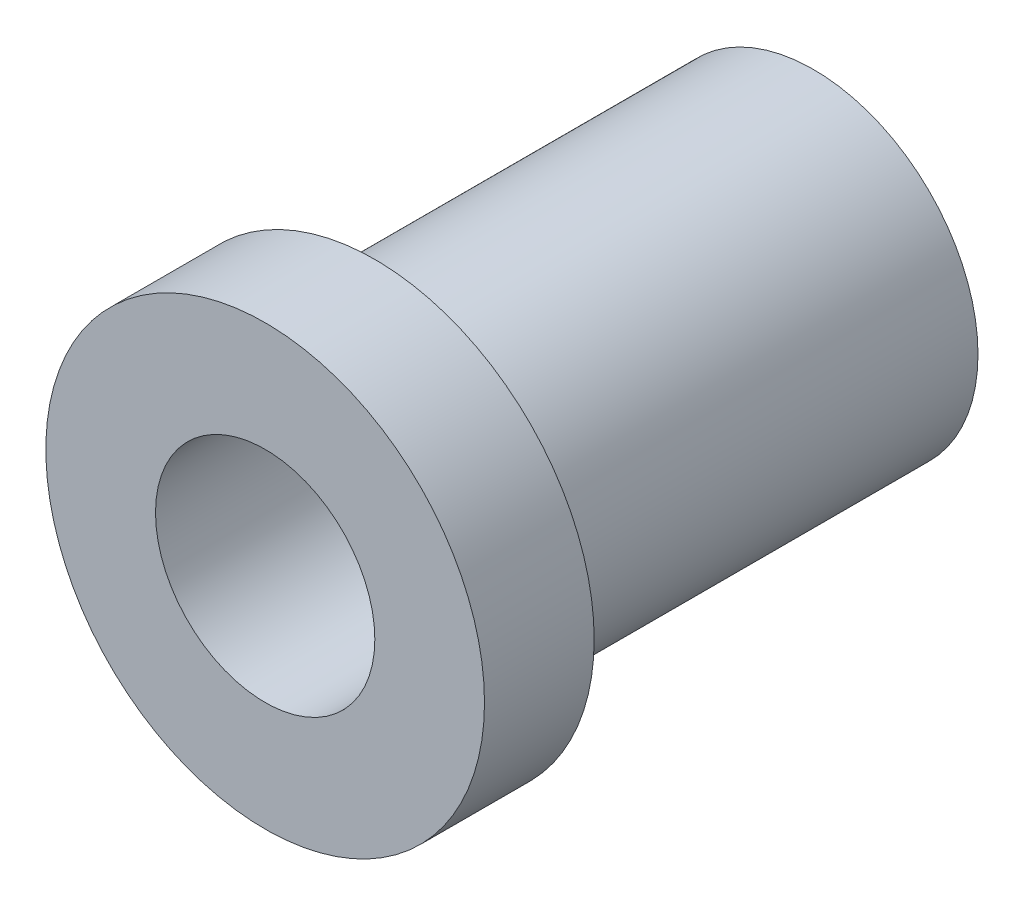
ISO-10303-21;
HEADER;
FILE_DESCRIPTION(('STEP AP214'),'2;1');
FILE_NAME('part.step','',(''),(''),'','','');
FILE_SCHEMA(('AUTOMOTIVE_DESIGN { 1 0 10303 214 1 1 1 1 }'));
ENDSEC;
DATA;
#1=APPLICATION_CONTEXT('core data for automotive mechanical design processes');
#2=APPLICATION_PROTOCOL_DEFINITION('international standard','automotive_design',2000,#1);
#3=PRODUCT_CONTEXT('',#1,'mechanical');
#4=PRODUCT('Part','Part','',(#3));
#5=PRODUCT_RELATED_PRODUCT_CATEGORY('part','',(#4));
#6=PRODUCT_DEFINITION_FORMATION('','',#4);
#7=PRODUCT_DEFINITION_CONTEXT('part definition',#1,'design');
#8=PRODUCT_DEFINITION('design','',#6,#7);
#9=PRODUCT_DEFINITION_SHAPE('','',#8);
#10=(LENGTH_UNIT() NAMED_UNIT(*) SI_UNIT(.MILLI.,.METRE.));
#11=(NAMED_UNIT(*) PLANE_ANGLE_UNIT() SI_UNIT($,.RADIAN.));
#12=(NAMED_UNIT(*) SI_UNIT($,.STERADIAN.) SOLID_ANGLE_UNIT());
#13=UNCERTAINTY_MEASURE_WITH_UNIT(LENGTH_MEASURE(1.E-05),#10,'distance_accuracy_value','');
#14=(GEOMETRIC_REPRESENTATION_CONTEXT(3) GLOBAL_UNCERTAINTY_ASSIGNED_CONTEXT((#13)) GLOBAL_UNIT_ASSIGNED_CONTEXT((#10,
#11,#12)) REPRESENTATION_CONTEXT('',''));
#15=CARTESIAN_POINT('',(0.,0.,0.));
#16=DIRECTION('',(0.,0.,1.));
#17=DIRECTION('',(1.,0.,0.));
#18=AXIS2_PLACEMENT_3D('',#15,#16,#17);
#19=CARTESIAN_POINT('',(0.,0.,2.));
#20=DIRECTION('',(0.,0.,-1.));
#21=DIRECTION('',(-1.,0.,0.));
#22=AXIS2_PLACEMENT_3D('',#19,#20,#21);
#23=CYLINDRICAL_SURFACE('',#22,4.);
#24=CARTESIAN_POINT('',(0.,0.,2.));
#25=DIRECTION('',(0.,0.,1.));
#26=DIRECTION('',(1.,0.,0.));
#27=AXIS2_PLACEMENT_3D('',#24,#25,#26);
#28=CIRCLE('',#27,4.);
#29=CARTESIAN_POINT('',(4.,0.,2.));
#30=VERTEX_POINT('',#29);
#31=EDGE_CURVE('E10',#30,#30,#28,.T.);
#32=ORIENTED_EDGE('',*,*,#31,.F.);
#33=EDGE_LOOP('',(#32));
#34=FACE_BOUND('',#33,.T.);
#35=CARTESIAN_POINT('',(0.,0.,0.));
#36=DIRECTION('',(0.,0.,1.));
#37=DIRECTION('',(1.,0.,0.));
#38=AXIS2_PLACEMENT_3D('',#35,#36,#37);
#39=CIRCLE('',#38,4.);
#40=CARTESIAN_POINT('',(4.,0.,0.));
#41=VERTEX_POINT('',#40);
#42=EDGE_CURVE('E44',#41,#41,#39,.T.);
#43=ORIENTED_EDGE('',*,*,#42,.T.);
#44=EDGE_LOOP('',(#43));
#45=FACE_BOUND('',#44,.T.);
#46=ADVANCED_FACE('F41',(#34,#45),#23,.T.);
#47=CARTESIAN_POINT('',(0.,0.,2.));
#48=DIRECTION('',(0.,0.,1.));
#49=DIRECTION('',(1.,0.,0.));
#50=AXIS2_PLACEMENT_3D('',#47,#48,#49);
#51=PLANE('',#50);
#52=CARTESIAN_POINT('',(0.,0.,2.));
#53=DIRECTION('',(0.,0.,1.));
#54=DIRECTION('',(1.,0.,0.));
#55=AXIS2_PLACEMENT_3D('',#52,#53,#54);
#56=CIRCLE('',#55,2.);
#57=CARTESIAN_POINT('',(2.,0.,2.));
#58=VERTEX_POINT('',#57);
#59=EDGE_CURVE('E63',#58,#58,#56,.T.);
#60=ORIENTED_EDGE('',*,*,#59,.F.);
#61=EDGE_LOOP('',(#60));
#62=FACE_BOUND('',#61,.T.);
#63=ORIENTED_EDGE('',*,*,#31,.T.);
#64=EDGE_LOOP('',(#63));
#65=FACE_BOUND('',#64,.T.);
#66=ADVANCED_FACE('F80',(#62,#65),#51,.T.);
#67=CARTESIAN_POINT('',(0.,0.,0.));
#68=DIRECTION('',(0.,0.,1.));
#69=DIRECTION('',(1.,0.,0.));
#70=AXIS2_PLACEMENT_3D('',#67,#68,#69);
#71=PLANE('',#70);
#72=CARTESIAN_POINT('',(0.,0.,0.));
#73=DIRECTION('',(0.,0.,1.));
#74=DIRECTION('',(1.,0.,0.));
#75=AXIS2_PLACEMENT_3D('',#72,#73,#74);
#76=CIRCLE('',#75,3.);
#77=CARTESIAN_POINT('',(3.,0.,0.));
#78=VERTEX_POINT('',#77);
#79=EDGE_CURVE('E56',#78,#78,#76,.T.);
#80=ORIENTED_EDGE('',*,*,#79,.T.);
#81=EDGE_LOOP('',(#80));
#82=FACE_BOUND('',#81,.T.);
#83=ORIENTED_EDGE('',*,*,#42,.F.);
#84=EDGE_LOOP('',(#83));
#85=FACE_BOUND('',#84,.T.);
#86=ADVANCED_FACE('F82',(#82,#85),#71,.F.);
#87=CARTESIAN_POINT('',(0.,0.,-8.));
#88=DIRECTION('',(0.,0.,1.));
#89=DIRECTION('',(1.,0.,0.));
#90=AXIS2_PLACEMENT_3D('',#87,#88,#89);
#91=CYLINDRICAL_SURFACE('',#90,3.);
#92=CARTESIAN_POINT('',(0.,0.,-8.));
#93=DIRECTION('',(0.,0.,1.));
#94=DIRECTION('',(1.,0.,0.));
#95=AXIS2_PLACEMENT_3D('',#92,#93,#94);
#96=CIRCLE('',#95,3.);
#97=CARTESIAN_POINT('',(3.,0.,-8.));
#98=VERTEX_POINT('',#97);
#99=EDGE_CURVE('E54',#98,#98,#96,.T.);
#100=ORIENTED_EDGE('',*,*,#99,.T.);
#101=EDGE_LOOP('',(#100));
#102=FACE_BOUND('',#101,.T.);
#103=ORIENTED_EDGE('',*,*,#79,.F.);
#104=EDGE_LOOP('',(#103));
#105=FACE_BOUND('',#104,.T.);
#106=ADVANCED_FACE('F88',(#102,#105),#91,.T.);
#107=CARTESIAN_POINT('',(0.,0.,-8.));
#108=DIRECTION('',(0.,0.,1.));
#109=DIRECTION('',(1.,0.,0.));
#110=AXIS2_PLACEMENT_3D('',#107,#108,#109);
#111=PLANE('',#110);
#112=ORIENTED_EDGE('',*,*,#99,.F.);
#113=EDGE_LOOP('',(#112));
#114=FACE_BOUND('',#113,.T.);
#115=ADVANCED_FACE('F76',(#114),#111,.F.);
#116=CARTESIAN_POINT('',(0.,0.,-6.));
#117=DIRECTION('',(0.,0.,1.));
#118=DIRECTION('',(1.,0.,0.));
#119=AXIS2_PLACEMENT_3D('',#116,#117,#118);
#120=CYLINDRICAL_SURFACE('',#119,2.);
#121=CARTESIAN_POINT('',(0.,0.,-6.));
#122=DIRECTION('',(0.,0.,1.));
#123=DIRECTION('',(1.,0.,0.));
#124=AXIS2_PLACEMENT_3D('',#121,#122,#123);
#125=CIRCLE('',#124,2.);
#126=CARTESIAN_POINT('',(2.,0.,-6.));
#127=VERTEX_POINT('',#126);
#128=EDGE_CURVE('E60',#127,#127,#125,.T.);
#129=ORIENTED_EDGE('',*,*,#128,.F.);
#130=EDGE_LOOP('',(#129));
#131=FACE_BOUND('',#130,.T.);
#132=ORIENTED_EDGE('',*,*,#59,.T.);
#133=EDGE_LOOP('',(#132));
#134=FACE_BOUND('',#133,.T.);
#135=ADVANCED_FACE('F73',(#131,#134),#120,.F.);
#136=CARTESIAN_POINT('',(0.,0.,-6.));
#137=DIRECTION('',(0.,0.,1.));
#138=DIRECTION('',(1.,0.,0.));
#139=AXIS2_PLACEMENT_3D('',#136,#137,#138);
#140=PLANE('',#139);
#141=ORIENTED_EDGE('',*,*,#128,.T.);
#142=EDGE_LOOP('',(#141));
#143=FACE_BOUND('',#142,.T.);
#144=ADVANCED_FACE('F71',(#143),#140,.T.);
#145=CLOSED_SHELL('',(#46,#66,#86,#106,#115,#135,#144));
#146=MANIFOLD_SOLID_BREP('B2',#145);
#147=ADVANCED_BREP_SHAPE_REPRESENTATION('',(#18,#146),#14);
#148=SHAPE_DEFINITION_REPRESENTATION(#9,#147);
ENDSEC;
END-ISO-10303-21;
